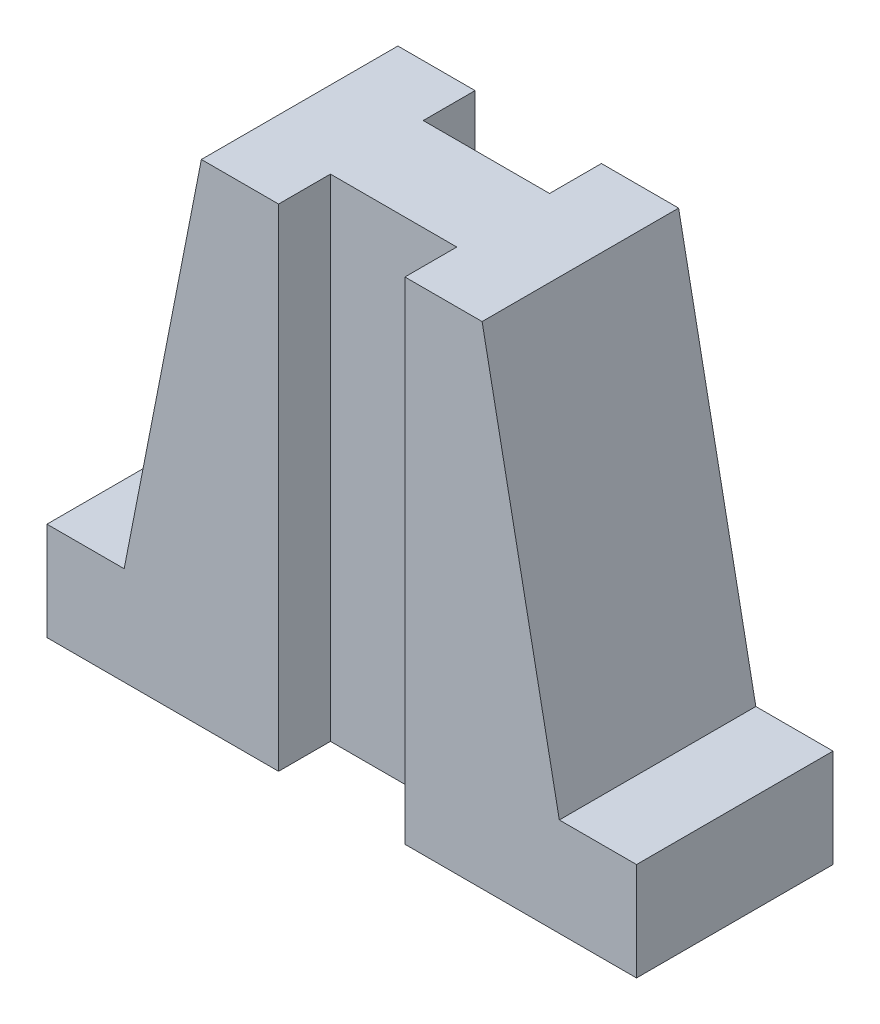
ISO-10303-21;
HEADER;
FILE_DESCRIPTION(('STEP AP214'),'2;1');
FILE_NAME('part.step','',(''),(''),'','','');
FILE_SCHEMA(('AUTOMOTIVE_DESIGN { 1 0 10303 214 1 1 1 1 }'));
ENDSEC;
DATA;
#1=APPLICATION_CONTEXT('core data for automotive mechanical design processes');
#2=APPLICATION_PROTOCOL_DEFINITION('international standard','automotive_design',2000,#1);
#3=PRODUCT_CONTEXT('',#1,'mechanical');
#4=PRODUCT('Part','Part','',(#3));
#5=PRODUCT_RELATED_PRODUCT_CATEGORY('part','',(#4));
#6=PRODUCT_DEFINITION_FORMATION('','',#4);
#7=PRODUCT_DEFINITION_CONTEXT('part definition',#1,'design');
#8=PRODUCT_DEFINITION('design','',#6,#7);
#9=PRODUCT_DEFINITION_SHAPE('','',#8);
#10=(LENGTH_UNIT() NAMED_UNIT(*) SI_UNIT(.MILLI.,.METRE.));
#11=(NAMED_UNIT(*) PLANE_ANGLE_UNIT() SI_UNIT($,.RADIAN.));
#12=(NAMED_UNIT(*) SI_UNIT($,.STERADIAN.) SOLID_ANGLE_UNIT());
#13=UNCERTAINTY_MEASURE_WITH_UNIT(LENGTH_MEASURE(1.E-05),#10,'distance_accuracy_value','');
#14=(GEOMETRIC_REPRESENTATION_CONTEXT(3) GLOBAL_UNCERTAINTY_ASSIGNED_CONTEXT((#13)) GLOBAL_UNIT_ASSIGNED_CONTEXT((#10,
#11,#12)) REPRESENTATION_CONTEXT('',''));
#15=CARTESIAN_POINT('',(0.,0.,0.));
#16=DIRECTION('',(0.,0.,1.));
#17=DIRECTION('',(1.,0.,0.));
#18=AXIS2_PLACEMENT_3D('',#15,#16,#17);
#19=CARTESIAN_POINT('',(0.,0.,14.));
#20=DIRECTION('',(0.,0.,1.));
#21=DIRECTION('',(1.,0.,0.));
#22=AXIS2_PLACEMENT_3D('',#19,#20,#21);
#23=PLANE('',#22);
#24=DIRECTION('',(0.,1.,0.));
#25=VECTOR('',#24,1.);
#26=CARTESIAN_POINT('',(-9.,0.,14.));
#27=LINE('',#26,#25);
#28=CARTESIAN_POINT('',(-9.,0.,14.));
#29=VERTEX_POINT('',#28);
#30=CARTESIAN_POINT('',(-9.,70.,14.));
#31=VERTEX_POINT('',#30);
#32=EDGE_CURVE('E196',#29,#31,#27,.T.);
#33=ORIENTED_EDGE('',*,*,#32,.T.);
#34=DIRECTION('',(-1.,0.,0.));
#35=VECTOR('',#34,1.);
#36=CARTESIAN_POINT('',(-20.,70.,14.));
#37=LINE('',#36,#35);
#38=CARTESIAN_POINT('',(-20.,70.,14.));
#39=VERTEX_POINT('',#38);
#40=EDGE_CURVE('E218',#31,#39,#37,.T.);
#41=ORIENTED_EDGE('',*,*,#40,.T.);
#42=DIRECTION('',(-0.192745304030928,-0.981248820521087,0.));
#43=VECTOR('',#42,1.);
#44=CARTESIAN_POINT('',(-31.,14.,14.));
#45=LINE('',#44,#43);
#46=CARTESIAN_POINT('',(-31.,14.,14.));
#47=VERTEX_POINT('',#46);
#48=EDGE_CURVE('E222',#39,#47,#45,.T.);
#49=ORIENTED_EDGE('',*,*,#48,.T.);
#50=DIRECTION('',(-1.,0.,0.));
#51=VECTOR('',#50,1.);
#52=CARTESIAN_POINT('',(-42.,14.,14.));
#53=LINE('',#52,#51);
#54=CARTESIAN_POINT('',(-42.,14.,14.));
#55=VERTEX_POINT('',#54);
#56=EDGE_CURVE('E224',#47,#55,#53,.T.);
#57=ORIENTED_EDGE('',*,*,#56,.T.);
#58=DIRECTION('',(0.,-1.,0.));
#59=VECTOR('',#58,1.);
#60=CARTESIAN_POINT('',(-42.,0.,14.));
#61=LINE('',#60,#59);
#62=CARTESIAN_POINT('',(-42.,0.,14.));
#63=VERTEX_POINT('',#62);
#64=EDGE_CURVE('E226',#55,#63,#61,.T.);
#65=ORIENTED_EDGE('',*,*,#64,.T.);
#66=DIRECTION('',(1.,0.,0.));
#67=VECTOR('',#66,1.);
#68=CARTESIAN_POINT('',(42.,0.,14.));
#69=LINE('',#68,#67);
#70=EDGE_CURVE('E229',#63,#29,#69,.T.);
#71=ORIENTED_EDGE('',*,*,#70,.T.);
#72=EDGE_LOOP('',(#33,#41,#49,#57,#65,#71));
#73=FACE_BOUND('',#72,.T.);
#74=ADVANCED_FACE('F36',(#73),#23,.T.);
#75=CARTESIAN_POINT('',(0.,0.,-14.));
#76=DIRECTION('',(0.,0.,1.));
#77=DIRECTION('',(1.,0.,0.));
#78=AXIS2_PLACEMENT_3D('',#75,#76,#77);
#79=PLANE('',#78);
#80=DIRECTION('',(-1.,0.,0.));
#81=VECTOR('',#80,1.);
#82=CARTESIAN_POINT('',(-20.,70.,-14.));
#83=LINE('',#82,#81);
#84=CARTESIAN_POINT('',(-9.,70.,-14.));
#85=VERTEX_POINT('',#84);
#86=CARTESIAN_POINT('',(-20.,70.,-14.));
#87=VERTEX_POINT('',#86);
#88=EDGE_CURVE('E239',#85,#87,#83,.T.);
#89=ORIENTED_EDGE('',*,*,#88,.F.);
#90=DIRECTION('',(0.,1.,0.));
#91=VECTOR('',#90,1.);
#92=CARTESIAN_POINT('',(-9.,0.,-14.));
#93=LINE('',#92,#91);
#94=CARTESIAN_POINT('',(-9.,0.,-14.));
#95=VERTEX_POINT('',#94);
#96=EDGE_CURVE('E182',#95,#85,#93,.T.);
#97=ORIENTED_EDGE('',*,*,#96,.F.);
#98=DIRECTION('',(1.,0.,0.));
#99=VECTOR('',#98,1.);
#100=CARTESIAN_POINT('',(42.,0.,-14.));
#101=LINE('',#100,#99);
#102=CARTESIAN_POINT('',(-42.,0.,-14.));
#103=VERTEX_POINT('',#102);
#104=EDGE_CURVE('E173',#103,#95,#101,.T.);
#105=ORIENTED_EDGE('',*,*,#104,.F.);
#106=DIRECTION('',(0.,-1.,0.));
#107=VECTOR('',#106,1.);
#108=CARTESIAN_POINT('',(-42.,0.,-14.));
#109=LINE('',#108,#107);
#110=CARTESIAN_POINT('',(-42.,14.,-14.));
#111=VERTEX_POINT('',#110);
#112=EDGE_CURVE('E247',#111,#103,#109,.T.);
#113=ORIENTED_EDGE('',*,*,#112,.F.);
#114=DIRECTION('',(-1.,0.,0.));
#115=VECTOR('',#114,1.);
#116=CARTESIAN_POINT('',(-42.,14.,-14.));
#117=LINE('',#116,#115);
#118=CARTESIAN_POINT('',(-31.,14.,-14.));
#119=VERTEX_POINT('',#118);
#120=EDGE_CURVE('E245',#119,#111,#117,.T.);
#121=ORIENTED_EDGE('',*,*,#120,.F.);
#122=DIRECTION('',(-0.192745304030928,-0.981248820521087,0.));
#123=VECTOR('',#122,1.);
#124=CARTESIAN_POINT('',(-31.,14.,-14.));
#125=LINE('',#124,#123);
#126=EDGE_CURVE('E243',#87,#119,#125,.T.);
#127=ORIENTED_EDGE('',*,*,#126,.F.);
#128=EDGE_LOOP('',(#89,#97,#105,#113,#121,#127));
#129=FACE_BOUND('',#128,.T.);
#130=ADVANCED_FACE('F297',(#129),#79,.F.);
#131=CARTESIAN_POINT('',(42.,0.,14.));
#132=DIRECTION('',(-1.,0.,0.));
#133=DIRECTION('',(0.,0.,1.));
#134=AXIS2_PLACEMENT_3D('',#131,#132,#133);
#135=PLANE('',#134);
#136=DIRECTION('',(0.,1.,0.));
#137=VECTOR('',#136,1.);
#138=CARTESIAN_POINT('',(42.,0.,-14.));
#139=LINE('',#138,#137);
#140=CARTESIAN_POINT('',(42.,0.,-14.));
#141=VERTEX_POINT('',#140);
#142=CARTESIAN_POINT('',(42.,14.,-14.));
#143=VERTEX_POINT('',#142);
#144=EDGE_CURVE('E184',#141,#143,#139,.T.);
#145=ORIENTED_EDGE('',*,*,#144,.T.);
#146=DIRECTION('',(0.,0.,-1.));
#147=VECTOR('',#146,1.);
#148=CARTESIAN_POINT('',(42.,14.,14.));
#149=LINE('',#148,#147);
#150=CARTESIAN_POINT('',(42.,14.,14.));
#151=VERTEX_POINT('',#150);
#152=EDGE_CURVE('E11',#151,#143,#149,.T.);
#153=ORIENTED_EDGE('',*,*,#152,.F.);
#154=DIRECTION('',(0.,1.,0.));
#155=VECTOR('',#154,1.);
#156=CARTESIAN_POINT('',(42.,0.,14.));
#157=LINE('',#156,#155);
#158=CARTESIAN_POINT('',(42.,0.,14.));
#159=VERTEX_POINT('',#158);
#160=EDGE_CURVE('E211',#159,#151,#157,.T.);
#161=ORIENTED_EDGE('',*,*,#160,.F.);
#162=DIRECTION('',(0.,0.,-1.));
#163=VECTOR('',#162,1.);
#164=CARTESIAN_POINT('',(42.,0.,14.));
#165=LINE('',#164,#163);
#166=EDGE_CURVE('E232',#159,#141,#165,.T.);
#167=ORIENTED_EDGE('',*,*,#166,.T.);
#168=EDGE_LOOP('',(#145,#153,#161,#167));
#169=FACE_BOUND('',#168,.T.);
#170=ADVANCED_FACE('F38',(#169),#135,.F.);
#171=CARTESIAN_POINT('',(42.,14.,14.));
#172=DIRECTION('',(0.,-1.,0.));
#173=DIRECTION('',(0.,0.,-1.));
#174=AXIS2_PLACEMENT_3D('',#171,#172,#173);
#175=PLANE('',#174);
#176=DIRECTION('',(-1.,0.,0.));
#177=VECTOR('',#176,1.);
#178=CARTESIAN_POINT('',(42.,14.,-14.));
#179=LINE('',#178,#177);
#180=CARTESIAN_POINT('',(31.,14.,-14.));
#181=VERTEX_POINT('',#180);
#182=EDGE_CURVE('E235',#143,#181,#179,.T.);
#183=ORIENTED_EDGE('',*,*,#182,.T.);
#184=DIRECTION('',(0.,0.,-1.));
#185=VECTOR('',#184,1.);
#186=CARTESIAN_POINT('',(31.,14.,14.));
#187=LINE('',#186,#185);
#188=CARTESIAN_POINT('',(31.,14.,14.));
#189=VERTEX_POINT('',#188);
#190=EDGE_CURVE('E44',#189,#181,#187,.T.);
#191=ORIENTED_EDGE('',*,*,#190,.F.);
#192=DIRECTION('',(-1.,0.,0.));
#193=VECTOR('',#192,1.);
#194=CARTESIAN_POINT('',(42.,14.,14.));
#195=LINE('',#194,#193);
#196=EDGE_CURVE('E214',#151,#189,#195,.T.);
#197=ORIENTED_EDGE('',*,*,#196,.F.);
#198=ORIENTED_EDGE('',*,*,#152,.T.);
#199=EDGE_LOOP('',(#183,#191,#197,#198));
#200=FACE_BOUND('',#199,.T.);
#201=ADVANCED_FACE('F289',(#200),#175,.F.);
#202=CARTESIAN_POINT('',(31.,14.,14.));
#203=DIRECTION('',(-0.981248820521088,-0.192745304030928,0.));
#204=DIRECTION('',(0.192745304030928,-0.981248820521088,0.));
#205=AXIS2_PLACEMENT_3D('',#202,#203,#204);
#206=PLANE('',#205);
#207=DIRECTION('',(-0.192745304030928,0.981248820521087,0.));
#208=VECTOR('',#207,1.);
#209=CARTESIAN_POINT('',(31.,14.,-14.));
#210=LINE('',#209,#208);
#211=CARTESIAN_POINT('',(20.,70.,-14.));
#212=VERTEX_POINT('',#211);
#213=EDGE_CURVE('E237',#181,#212,#210,.T.);
#214=ORIENTED_EDGE('',*,*,#213,.T.);
#215=DIRECTION('',(0.,0.,-1.));
#216=VECTOR('',#215,1.);
#217=CARTESIAN_POINT('',(20.,70.,14.));
#218=LINE('',#217,#216);
#219=CARTESIAN_POINT('',(20.,70.,14.));
#220=VERTEX_POINT('',#219);
#221=EDGE_CURVE('E264',#220,#212,#218,.T.);
#222=ORIENTED_EDGE('',*,*,#221,.F.);
#223=DIRECTION('',(-0.192745304030928,0.981248820521087,0.));
#224=VECTOR('',#223,1.);
#225=CARTESIAN_POINT('',(31.,14.,14.));
#226=LINE('',#225,#224);
#227=EDGE_CURVE('E216',#189,#220,#226,.T.);
#228=ORIENTED_EDGE('',*,*,#227,.F.);
#229=ORIENTED_EDGE('',*,*,#190,.T.);
#230=EDGE_LOOP('',(#214,#222,#228,#229));
#231=FACE_BOUND('',#230,.T.);
#232=ADVANCED_FACE('F271',(#231),#206,.F.);
#233=CARTESIAN_POINT('',(-20.,70.,14.));
#234=DIRECTION('',(0.,-1.,0.));
#235=DIRECTION('',(0.,0.,-1.));
#236=AXIS2_PLACEMENT_3D('',#233,#234,#235);
#237=PLANE('',#236);
#238=DIRECTION('',(1.,0.,0.));
#239=VECTOR('',#238,1.);
#240=CARTESIAN_POINT('',(-9.,70.,-6.60889072360491));
#241=LINE('',#240,#239);
#242=CARTESIAN_POINT('',(-9.,70.,-6.60889072360491));
#243=VERTEX_POINT('',#242);
#244=CARTESIAN_POINT('',(9.,70.,-6.60889072360491));
#245=VERTEX_POINT('',#244);
#246=EDGE_CURVE('E175',#243,#245,#241,.T.);
#247=ORIENTED_EDGE('',*,*,#246,.F.);
#248=DIRECTION('',(0.,0.,1.));
#249=VECTOR('',#248,1.);
#250=CARTESIAN_POINT('',(-9.,70.,-14.));
#251=LINE('',#250,#249);
#252=EDGE_CURVE('E155',#85,#243,#251,.T.);
#253=ORIENTED_EDGE('',*,*,#252,.F.);
#254=ORIENTED_EDGE('',*,*,#88,.T.);
#255=DIRECTION('',(0.,0.,-1.));
#256=VECTOR('',#255,1.);
#257=CARTESIAN_POINT('',(-20.,70.,14.));
#258=LINE('',#257,#256);
#259=EDGE_CURVE('E261',#39,#87,#258,.T.);
#260=ORIENTED_EDGE('',*,*,#259,.F.);
#261=ORIENTED_EDGE('',*,*,#40,.F.);
#262=DIRECTION('',(0.,0.,1.));
#263=VECTOR('',#262,1.);
#264=CARTESIAN_POINT('',(-9.,70.,14.));
#265=LINE('',#264,#263);
#266=CARTESIAN_POINT('',(-9.,70.,6.60889072360491));
#267=VERTEX_POINT('',#266);
#268=EDGE_CURVE('E197',#267,#31,#265,.T.);
#269=ORIENTED_EDGE('',*,*,#268,.F.);
#270=DIRECTION('',(-1.,0.,0.));
#271=VECTOR('',#270,1.);
#272=CARTESIAN_POINT('',(-9.,70.,6.60889072360491));
#273=LINE('',#272,#271);
#274=CARTESIAN_POINT('',(9.,70.,6.60889072360491));
#275=VERTEX_POINT('',#274);
#276=EDGE_CURVE('E191',#275,#267,#273,.T.);
#277=ORIENTED_EDGE('',*,*,#276,.F.);
#278=DIRECTION('',(0.,0.,-1.));
#279=VECTOR('',#278,1.);
#280=CARTESIAN_POINT('',(9.,70.,14.));
#281=LINE('',#280,#279);
#282=CARTESIAN_POINT('',(9.,70.,14.));
#283=VERTEX_POINT('',#282);
#284=EDGE_CURVE('E199',#283,#275,#281,.T.);
#285=ORIENTED_EDGE('',*,*,#284,.F.);
#286=EDGE_CURVE('E219',#220,#283,#37,.T.);
#287=ORIENTED_EDGE('',*,*,#286,.F.);
#288=ORIENTED_EDGE('',*,*,#221,.T.);
#289=CARTESIAN_POINT('',(9.,70.,-14.));
#290=VERTEX_POINT('',#289);
#291=EDGE_CURVE('E240',#212,#290,#83,.T.);
#292=ORIENTED_EDGE('',*,*,#291,.T.);
#293=DIRECTION('',(0.,0.,-1.));
#294=VECTOR('',#293,1.);
#295=CARTESIAN_POINT('',(9.,70.,-14.));
#296=LINE('',#295,#294);
#297=EDGE_CURVE('E59',#245,#290,#296,.T.);
#298=ORIENTED_EDGE('',*,*,#297,.F.);
#299=EDGE_LOOP('',(#247,#253,#254,#260,#261,#269,#277,#285,#287,#288,#292,#298));
#300=FACE_BOUND('',#299,.T.);
#301=ADVANCED_FACE('F280',(#300),#237,.F.);
#302=CARTESIAN_POINT('',(-31.,14.,14.));
#303=DIRECTION('',(0.981248820521088,-0.192745304030928,0.));
#304=DIRECTION('',(0.192745304030928,0.981248820521088,0.));
#305=AXIS2_PLACEMENT_3D('',#302,#303,#304);
#306=PLANE('',#305);
#307=ORIENTED_EDGE('',*,*,#126,.T.);
#308=DIRECTION('',(0.,0.,-1.));
#309=VECTOR('',#308,1.);
#310=CARTESIAN_POINT('',(-31.,14.,14.));
#311=LINE('',#310,#309);
#312=EDGE_CURVE('E258',#47,#119,#311,.T.);
#313=ORIENTED_EDGE('',*,*,#312,.F.);
#314=ORIENTED_EDGE('',*,*,#48,.F.);
#315=ORIENTED_EDGE('',*,*,#259,.T.);
#316=EDGE_LOOP('',(#307,#313,#314,#315));
#317=FACE_BOUND('',#316,.T.);
#318=ADVANCED_FACE('F302',(#317),#306,.F.);
#319=CARTESIAN_POINT('',(-42.,14.,14.));
#320=DIRECTION('',(0.,-1.,0.));
#321=DIRECTION('',(0.,0.,-1.));
#322=AXIS2_PLACEMENT_3D('',#319,#320,#321);
#323=PLANE('',#322);
#324=ORIENTED_EDGE('',*,*,#120,.T.);
#325=DIRECTION('',(0.,0.,-1.));
#326=VECTOR('',#325,1.);
#327=CARTESIAN_POINT('',(-42.,14.,14.));
#328=LINE('',#327,#326);
#329=EDGE_CURVE('E255',#55,#111,#328,.T.);
#330=ORIENTED_EDGE('',*,*,#329,.F.);
#331=ORIENTED_EDGE('',*,*,#56,.F.);
#332=ORIENTED_EDGE('',*,*,#312,.T.);
#333=EDGE_LOOP('',(#324,#330,#331,#332));
#334=FACE_BOUND('',#333,.T.);
#335=ADVANCED_FACE('F306',(#334),#323,.F.);
#336=CARTESIAN_POINT('',(-42.,0.,14.));
#337=DIRECTION('',(1.,0.,0.));
#338=DIRECTION('',(0.,0.,-1.));
#339=AXIS2_PLACEMENT_3D('',#336,#337,#338);
#340=PLANE('',#339);
#341=ORIENTED_EDGE('',*,*,#112,.T.);
#342=DIRECTION('',(0.,0.,-1.));
#343=VECTOR('',#342,1.);
#344=CARTESIAN_POINT('',(-42.,0.,14.));
#345=LINE('',#344,#343);
#346=EDGE_CURVE('E253',#63,#103,#345,.T.);
#347=ORIENTED_EDGE('',*,*,#346,.F.);
#348=ORIENTED_EDGE('',*,*,#64,.F.);
#349=ORIENTED_EDGE('',*,*,#329,.T.);
#350=EDGE_LOOP('',(#341,#347,#348,#349));
#351=FACE_BOUND('',#350,.T.);
#352=ADVANCED_FACE('F338',(#351),#340,.F.);
#353=CARTESIAN_POINT('',(42.,0.,14.));
#354=DIRECTION('',(0.,1.,0.));
#355=DIRECTION('',(0.,0.,1.));
#356=AXIS2_PLACEMENT_3D('',#353,#354,#355);
#357=PLANE('',#356);
#358=ORIENTED_EDGE('',*,*,#104,.T.);
#359=DIRECTION('',(0.,0.,1.));
#360=VECTOR('',#359,1.);
#361=CARTESIAN_POINT('',(-9.,0.,-14.));
#362=LINE('',#361,#360);
#363=CARTESIAN_POINT('',(-9.,0.,-6.60889072360491));
#364=VERTEX_POINT('',#363);
#365=EDGE_CURVE('E152',#95,#364,#362,.T.);
#366=ORIENTED_EDGE('',*,*,#365,.T.);
#367=DIRECTION('',(1.,0.,0.));
#368=VECTOR('',#367,1.);
#369=CARTESIAN_POINT('',(-9.,0.,-6.60889072360491));
#370=LINE('',#369,#368);
#371=CARTESIAN_POINT('',(9.,0.,-6.60889072360491));
#372=VERTEX_POINT('',#371);
#373=EDGE_CURVE('E163',#364,#372,#370,.T.);
#374=ORIENTED_EDGE('',*,*,#373,.T.);
#375=DIRECTION('',(0.,0.,-1.));
#376=VECTOR('',#375,1.);
#377=CARTESIAN_POINT('',(9.,0.,-14.));
#378=LINE('',#377,#376);
#379=CARTESIAN_POINT('',(9.,0.,-14.));
#380=VERTEX_POINT('',#379);
#381=EDGE_CURVE('E160',#372,#380,#378,.T.);
#382=ORIENTED_EDGE('',*,*,#381,.T.);
#383=EDGE_CURVE('E249',#380,#141,#101,.T.);
#384=ORIENTED_EDGE('',*,*,#383,.T.);
#385=ORIENTED_EDGE('',*,*,#166,.F.);
#386=CARTESIAN_POINT('',(9.00000000000001,0.,14.));
#387=VERTEX_POINT('',#386);
#388=EDGE_CURVE('E228',#387,#159,#69,.T.);
#389=ORIENTED_EDGE('',*,*,#388,.F.);
#390=DIRECTION('',(0.,0.,-1.));
#391=VECTOR('',#390,1.);
#392=CARTESIAN_POINT('',(9.,0.,14.));
#393=LINE('',#392,#391);
#394=CARTESIAN_POINT('',(9.,0.,6.60889072360491));
#395=VERTEX_POINT('',#394);
#396=EDGE_CURVE('E51',#387,#395,#393,.T.);
#397=ORIENTED_EDGE('',*,*,#396,.T.);
#398=DIRECTION('',(-1.,0.,0.));
#399=VECTOR('',#398,1.);
#400=CARTESIAN_POINT('',(-9.,0.,6.60889072360491));
#401=LINE('',#400,#399);
#402=CARTESIAN_POINT('',(-9.,0.,6.60889072360491));
#403=VERTEX_POINT('',#402);
#404=EDGE_CURVE('E193',#395,#403,#401,.T.);
#405=ORIENTED_EDGE('',*,*,#404,.T.);
#406=DIRECTION('',(0.,0.,1.));
#407=VECTOR('',#406,1.);
#408=CARTESIAN_POINT('',(-9.,0.,14.));
#409=LINE('',#408,#407);
#410=EDGE_CURVE('E188',#403,#29,#409,.T.);
#411=ORIENTED_EDGE('',*,*,#410,.T.);
#412=ORIENTED_EDGE('',*,*,#70,.F.);
#413=ORIENTED_EDGE('',*,*,#346,.T.);
#414=EDGE_LOOP('',(#358,#366,#374,#382,#384,#385,#389,#397,#405,#411,#412,#413));
#415=FACE_BOUND('',#414,.T.);
#416=ADVANCED_FACE('F170',(#415),#357,.F.);
#417=DIRECTION('',(0.,1.,0.));
#418=VECTOR('',#417,1.);
#419=CARTESIAN_POINT('',(9.,0.,14.));
#420=LINE('',#419,#418);
#421=EDGE_CURVE('E207',#387,#283,#420,.T.);
#422=ORIENTED_EDGE('',*,*,#421,.F.);
#423=ORIENTED_EDGE('',*,*,#388,.T.);
#424=ORIENTED_EDGE('',*,*,#160,.T.);
#425=ORIENTED_EDGE('',*,*,#196,.T.);
#426=ORIENTED_EDGE('',*,*,#227,.T.);
#427=ORIENTED_EDGE('',*,*,#286,.T.);
#428=EDGE_LOOP('',(#422,#423,#424,#425,#426,#427));
#429=FACE_BOUND('',#428,.T.);
#430=ADVANCED_FACE('F285',(#429),#23,.T.);
#431=ORIENTED_EDGE('',*,*,#383,.F.);
#432=DIRECTION('',(0.,1.,0.));
#433=VECTOR('',#432,1.);
#434=CARTESIAN_POINT('',(9.,0.,-14.));
#435=LINE('',#434,#433);
#436=EDGE_CURVE('E185',#380,#290,#435,.T.);
#437=ORIENTED_EDGE('',*,*,#436,.T.);
#438=ORIENTED_EDGE('',*,*,#291,.F.);
#439=ORIENTED_EDGE('',*,*,#213,.F.);
#440=ORIENTED_EDGE('',*,*,#182,.F.);
#441=ORIENTED_EDGE('',*,*,#144,.F.);
#442=EDGE_LOOP('',(#431,#437,#438,#439,#440,#441));
#443=FACE_BOUND('',#442,.T.);
#444=ADVANCED_FACE('F277',(#443),#79,.F.);
#445=CARTESIAN_POINT('',(-9.,0.,-14.));
#446=DIRECTION('',(-1.,0.,0.));
#447=DIRECTION('',(0.,0.,1.));
#448=AXIS2_PLACEMENT_3D('',#445,#446,#447);
#449=PLANE('',#448);
#450=ORIENTED_EDGE('',*,*,#252,.T.);
#451=DIRECTION('',(0.,1.,0.));
#452=VECTOR('',#451,1.);
#453=CARTESIAN_POINT('',(-9.,0.,-6.60889072360491));
#454=LINE('',#453,#452);
#455=EDGE_CURVE('E148',#364,#243,#454,.T.);
#456=ORIENTED_EDGE('',*,*,#455,.F.);
#457=ORIENTED_EDGE('',*,*,#365,.F.);
#458=ORIENTED_EDGE('',*,*,#96,.T.);
#459=EDGE_LOOP('',(#450,#456,#457,#458));
#460=FACE_BOUND('',#459,.T.);
#461=ADVANCED_FACE('F150',(#460),#449,.F.);
#462=CARTESIAN_POINT('',(9.,0.,-14.));
#463=DIRECTION('',(1.,0.,0.));
#464=DIRECTION('',(0.,0.,-1.));
#465=AXIS2_PLACEMENT_3D('',#462,#463,#464);
#466=PLANE('',#465);
#467=ORIENTED_EDGE('',*,*,#297,.T.);
#468=ORIENTED_EDGE('',*,*,#436,.F.);
#469=ORIENTED_EDGE('',*,*,#381,.F.);
#470=DIRECTION('',(0.,1.,0.));
#471=VECTOR('',#470,1.);
#472=CARTESIAN_POINT('',(9.,0.,-6.60889072360491));
#473=LINE('',#472,#471);
#474=EDGE_CURVE('E159',#372,#245,#473,.T.);
#475=ORIENTED_EDGE('',*,*,#474,.T.);
#476=EDGE_LOOP('',(#467,#468,#469,#475));
#477=FACE_BOUND('',#476,.T.);
#478=ADVANCED_FACE('F292',(#477),#466,.F.);
#479=CARTESIAN_POINT('',(-9.,0.,-6.60889072360491));
#480=DIRECTION('',(0.,0.,1.));
#481=DIRECTION('',(1.,0.,0.));
#482=AXIS2_PLACEMENT_3D('',#479,#480,#481);
#483=PLANE('',#482);
#484=ORIENTED_EDGE('',*,*,#246,.T.);
#485=ORIENTED_EDGE('',*,*,#474,.F.);
#486=ORIENTED_EDGE('',*,*,#373,.F.);
#487=ORIENTED_EDGE('',*,*,#455,.T.);
#488=EDGE_LOOP('',(#484,#485,#486,#487));
#489=FACE_BOUND('',#488,.T.);
#490=ADVANCED_FACE('F164',(#489),#483,.F.);
#491=CARTESIAN_POINT('',(-9.,0.,14.));
#492=DIRECTION('',(-1.,0.,0.));
#493=DIRECTION('',(0.,0.,1.));
#494=AXIS2_PLACEMENT_3D('',#491,#492,#493);
#495=PLANE('',#494);
#496=ORIENTED_EDGE('',*,*,#268,.T.);
#497=ORIENTED_EDGE('',*,*,#32,.F.);
#498=ORIENTED_EDGE('',*,*,#410,.F.);
#499=DIRECTION('',(0.,1.,0.));
#500=VECTOR('',#499,1.);
#501=CARTESIAN_POINT('',(-9.,0.,6.60889072360491));
#502=LINE('',#501,#500);
#503=EDGE_CURVE('E180',#403,#267,#502,.T.);
#504=ORIENTED_EDGE('',*,*,#503,.T.);
#505=EDGE_LOOP('',(#496,#497,#498,#504));
#506=FACE_BOUND('',#505,.T.);
#507=ADVANCED_FACE('F314',(#506),#495,.F.);
#508=CARTESIAN_POINT('',(-9.,0.,6.60889072360491));
#509=DIRECTION('',(0.,0.,-1.));
#510=DIRECTION('',(-1.,0.,0.));
#511=AXIS2_PLACEMENT_3D('',#508,#509,#510);
#512=PLANE('',#511);
#513=ORIENTED_EDGE('',*,*,#276,.T.);
#514=ORIENTED_EDGE('',*,*,#503,.F.);
#515=ORIENTED_EDGE('',*,*,#404,.F.);
#516=DIRECTION('',(0.,1.,0.));
#517=VECTOR('',#516,1.);
#518=CARTESIAN_POINT('',(9.,0.,6.60889072360491));
#519=LINE('',#518,#517);
#520=EDGE_CURVE('E205',#395,#275,#519,.T.);
#521=ORIENTED_EDGE('',*,*,#520,.T.);
#522=EDGE_LOOP('',(#513,#514,#515,#521));
#523=FACE_BOUND('',#522,.T.);
#524=ADVANCED_FACE('F318',(#523),#512,.F.);
#525=CARTESIAN_POINT('',(9.,0.,14.));
#526=DIRECTION('',(1.,0.,0.));
#527=DIRECTION('',(0.,0.,-1.));
#528=AXIS2_PLACEMENT_3D('',#525,#526,#527);
#529=PLANE('',#528);
#530=ORIENTED_EDGE('',*,*,#284,.T.);
#531=ORIENTED_EDGE('',*,*,#520,.F.);
#532=ORIENTED_EDGE('',*,*,#396,.F.);
#533=ORIENTED_EDGE('',*,*,#421,.T.);
#534=EDGE_LOOP('',(#530,#531,#532,#533));
#535=FACE_BOUND('',#534,.T.);
#536=ADVANCED_FACE('F319',(#535),#529,.F.);
#537=CLOSED_SHELL('',(#74,#130,#170,#201,#232,#301,#318,#335,#352,#416,#430,#444,#461,#478,#490,
#507,#524,#536));
#538=MANIFOLD_SOLID_BREP('B2',#537);
#539=ADVANCED_BREP_SHAPE_REPRESENTATION('',(#18,#538),#14);
#540=SHAPE_DEFINITION_REPRESENTATION(#9,#539);
ENDSEC;
END-ISO-10303-21;
